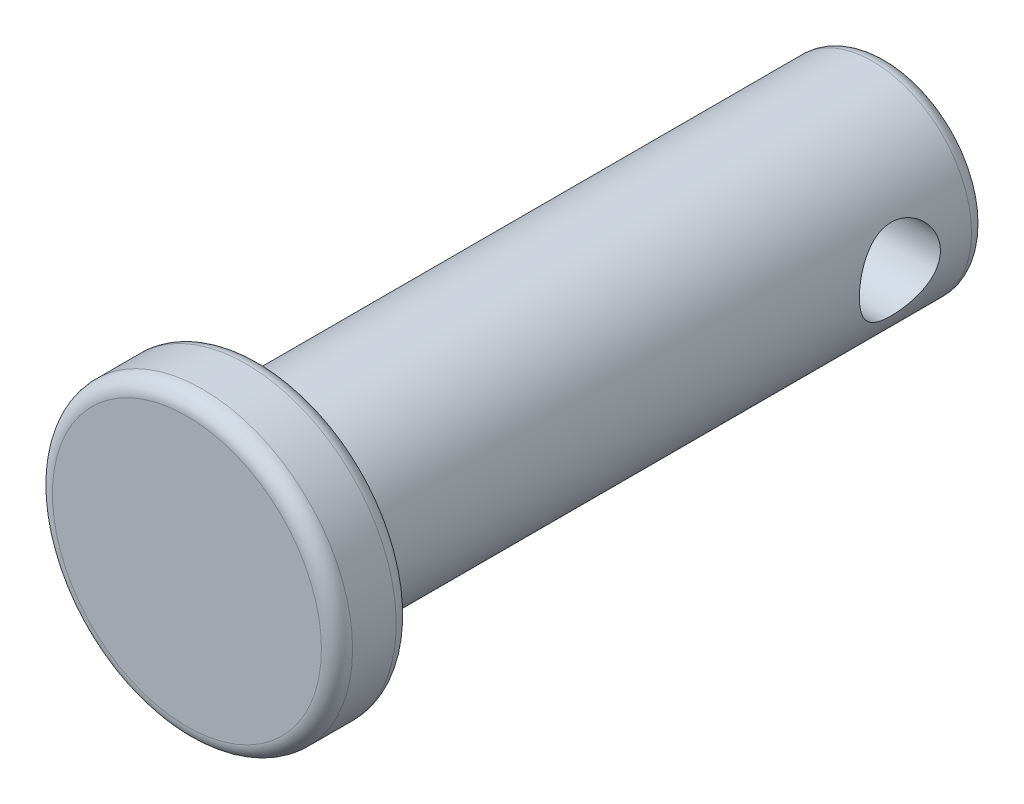
ISO-10303-21;
HEADER;
FILE_DESCRIPTION(('STEP AP214'),'2;1');
FILE_NAME('part.step','',(''),(''),'','','');
FILE_SCHEMA(('AUTOMOTIVE_DESIGN { 1 0 10303 214 1 1 1 1 }'));
ENDSEC;
DATA;
#1=APPLICATION_CONTEXT('core data for automotive mechanical design processes');
#2=APPLICATION_PROTOCOL_DEFINITION('international standard','automotive_design',2000,#1);
#3=PRODUCT_CONTEXT('',#1,'mechanical');
#4=PRODUCT('Part','Part','',(#3));
#5=PRODUCT_RELATED_PRODUCT_CATEGORY('part','',(#4));
#6=PRODUCT_DEFINITION_FORMATION('','',#4);
#7=PRODUCT_DEFINITION_CONTEXT('part definition',#1,'design');
#8=PRODUCT_DEFINITION('design','',#6,#7);
#9=PRODUCT_DEFINITION_SHAPE('','',#8);
#10=(LENGTH_UNIT() NAMED_UNIT(*) SI_UNIT(.MILLI.,.METRE.));
#11=(NAMED_UNIT(*) PLANE_ANGLE_UNIT() SI_UNIT($,.RADIAN.));
#12=(NAMED_UNIT(*) SI_UNIT($,.STERADIAN.) SOLID_ANGLE_UNIT());
#13=UNCERTAINTY_MEASURE_WITH_UNIT(LENGTH_MEASURE(1.E-05),#10,'distance_accuracy_value','');
#14=(GEOMETRIC_REPRESENTATION_CONTEXT(3) GLOBAL_UNCERTAINTY_ASSIGNED_CONTEXT((#13)) GLOBAL_UNIT_ASSIGNED_CONTEXT((#10,
#11,#12)) REPRESENTATION_CONTEXT('',''));
#15=CARTESIAN_POINT('',(0.,0.,0.));
#16=DIRECTION('',(0.,0.,1.));
#17=DIRECTION('',(1.,0.,0.));
#18=AXIS2_PLACEMENT_3D('',#15,#16,#17);
#19=CARTESIAN_POINT('',(0.,0.,0.));
#20=DIRECTION('',(0.,0.,1.));
#21=DIRECTION('',(1.,0.,0.));
#22=AXIS2_PLACEMENT_3D('',#19,#20,#21);
#23=PLANE('',#22);
#24=CARTESIAN_POINT('',(0.,0.,0.));
#25=DIRECTION('',(0.,0.,1.));
#26=DIRECTION('',(1.,0.,0.));
#27=AXIS2_PLACEMENT_3D('',#24,#25,#26);
#28=CIRCLE('',#27,4.31499999999996);
#29=CARTESIAN_POINT('',(4.31499999999996,0.,0.));
#30=VERTEX_POINT('',#29);
#31=EDGE_CURVE('E48',#30,#30,#28,.T.);
#32=ORIENTED_EDGE('',*,*,#31,.T.);
#33=EDGE_LOOP('',(#32));
#34=FACE_BOUND('',#33,.T.);
#35=ADVANCED_FACE('F37',(#34),#23,.T.);
#36=CARTESIAN_POINT('',(0.,0.,-335.576810525071));
#37=DIRECTION('',(0.,0.,-1.));
#38=DIRECTION('',(-1.,0.,0.));
#39=AXIS2_PLACEMENT_3D('',#36,#37,#38);
#40=CYLINDRICAL_SURFACE('',#39,4.81499999999996);
#41=CARTESIAN_POINT('',(0.,0.,-1.90000000000001));
#42=DIRECTION('',(0.,0.,-1.));
#43=DIRECTION('',(-1.,0.,0.));
#44=AXIS2_PLACEMENT_3D('',#41,#42,#43);
#45=CIRCLE('',#44,4.81499999999996);
#46=CARTESIAN_POINT('',(-4.81499999999996,0.,-1.90000000000001));
#47=VERTEX_POINT('',#46);
#48=EDGE_CURVE('E52',#47,#47,#45,.F.);
#49=ORIENTED_EDGE('',*,*,#48,.T.);
#50=EDGE_LOOP('',(#49));
#51=FACE_BOUND('',#50,.T.);
#52=CARTESIAN_POINT('',(0.,0.,-0.5));
#53=DIRECTION('',(0.,0.,1.));
#54=DIRECTION('',(1.,0.,0.));
#55=AXIS2_PLACEMENT_3D('',#52,#53,#54);
#56=CIRCLE('',#55,4.81499999999996);
#57=CARTESIAN_POINT('',(4.81499999999996,0.,-0.5));
#58=VERTEX_POINT('',#57);
#59=EDGE_CURVE('E57',#58,#58,#56,.F.);
#60=ORIENTED_EDGE('',*,*,#59,.T.);
#61=EDGE_LOOP('',(#60));
#62=FACE_BOUND('',#61,.T.);
#63=ADVANCED_FACE('F98',(#51,#62),#40,.T.);
#64=CARTESIAN_POINT('',(0.,4.81499999999996,-2.4));
#65=DIRECTION('',(0.,0.,-1.));
#66=DIRECTION('',(-1.,0.,0.));
#67=AXIS2_PLACEMENT_3D('',#64,#65,#66);
#68=PLANE('',#67);
#69=CARTESIAN_POINT('',(0.,0.,-2.4));
#70=DIRECTION('',(0.,0.,-1.));
#71=DIRECTION('',(-1.,0.,0.));
#72=AXIS2_PLACEMENT_3D('',#69,#70,#71);
#73=CIRCLE('',#72,4.31499999999996);
#74=CARTESIAN_POINT('',(-4.31499999999996,0.,-2.4));
#75=VERTEX_POINT('',#74);
#76=EDGE_CURVE('E60',#75,#75,#73,.T.);
#77=ORIENTED_EDGE('',*,*,#76,.T.);
#78=EDGE_LOOP('',(#77));
#79=FACE_BOUND('',#78,.T.);
#80=CARTESIAN_POINT('',(0.,0.,-2.40000000000001));
#81=DIRECTION('',(0.,0.,-1.));
#82=DIRECTION('',(-1.,0.,0.));
#83=AXIS2_PLACEMENT_3D('',#80,#81,#82);
#84=CIRCLE('',#83,3.17499999999996);
#85=CARTESIAN_POINT('',(-3.17499999999996,0.,-2.40000000000001));
#86=VERTEX_POINT('',#85);
#87=EDGE_CURVE('E63',#86,#86,#84,.T.);
#88=ORIENTED_EDGE('',*,*,#87,.F.);
#89=EDGE_LOOP('',(#88));
#90=FACE_BOUND('',#89,.T.);
#91=ADVANCED_FACE('F104',(#79,#90),#68,.T.);
#92=CARTESIAN_POINT('',(0.,0.,-335.576810525071));
#93=DIRECTION('',(0.,0.,-1.));
#94=DIRECTION('',(-1.,0.,0.));
#95=AXIS2_PLACEMENT_3D('',#92,#93,#94);
#96=CYLINDRICAL_SURFACE('',#95,3.17499999999996);
#97=CARTESIAN_POINT('',(0.,0.,-22.));
#98=DIRECTION('',(0.,0.,1.));
#99=DIRECTION('',(1.,0.,0.));
#100=AXIS2_PLACEMENT_3D('',#97,#98,#99);
#101=CIRCLE('',#100,3.17499999999996);
#102=CARTESIAN_POINT('',(3.17499999999996,0.,-22.));
#103=VERTEX_POINT('',#102);
#104=EDGE_CURVE('E10',#103,#103,#101,.T.);
#105=ORIENTED_EDGE('',*,*,#104,.T.);
#106=EDGE_LOOP('',(#105));
#107=FACE_BOUND('',#106,.T.);
#108=CARTESIAN_POINT('',(-3.17499999999996,0.,-18.4));
#109=CARTESIAN_POINT('',(-3.17499471773082,0.0697385475572229,-18.4000070749055));
#110=CARTESIAN_POINT('',(-3.17267552002936,0.13959187545915,-18.4056450814286));
#111=CARTESIAN_POINT('',(-3.16362322232198,0.277323448606077,-18.4279991908106));
#112=CARTESIAN_POINT('',(-3.15687839039144,0.345195941955909,-18.4447447399727));
#113=CARTESIAN_POINT('',(-3.1397005130023,0.47674941596077,-18.4885964065181));
#114=CARTESIAN_POINT('',(-3.12927979006259,0.5404435676328,-18.5156679329657));
#115=CARTESIAN_POINT('',(-3.10576988962442,0.662326355552351,-18.5792627601992));
#116=CARTESIAN_POINT('',(-3.0926815720534,0.720516757164088,-18.6157830161066));
#117=CARTESIAN_POINT('',(-3.06443707139534,0.832672374310063,-18.6991239927602));
#118=CARTESIAN_POINT('',(-3.04921469584617,0.886333392155718,-18.746331472875));
#119=CARTESIAN_POINT('',(-3.01871133808473,0.985236444135586,-18.848889773038));
#120=CARTESIAN_POINT('',(-3.00343033001475,1.0304741848533,-18.9042447203234));
#121=CARTESIAN_POINT('',(-2.97373634122923,1.11335020809138,-19.0246917046801));
#122=CARTESIAN_POINT('',(-2.9593982127194,1.15052984781277,-19.0901196930443));
#123=CARTESIAN_POINT('',(-2.9342581638112,1.21322024662256,-19.2269742640324));
#124=CARTESIAN_POINT('',(-2.92345448450506,1.23873681232245,-19.2983978406643));
#125=CARTESIAN_POINT('',(-2.90732044867926,1.27613180906288,-19.4417168289158));
#126=CARTESIAN_POINT('',(-2.90175688693594,1.28859442354419,-19.5134325725601));
#127=CARTESIAN_POINT('',(-2.89605999939638,1.30135139579376,-19.6581365641312));
#128=CARTESIAN_POINT('',(-2.89592382386313,1.30165213935049,-19.731124124128));
#129=CARTESIAN_POINT('',(-2.90089903773204,1.29051801449662,-19.8705724632797));
#130=CARTESIAN_POINT('',(-2.90562524591533,1.27994458280539,-19.9371184861099));
#131=CARTESIAN_POINT('',(-2.91914371857914,1.24880343181336,-20.067392456085));
#132=CARTESIAN_POINT('',(-2.9279367308279,1.22823387447742,-20.1311198826092));
#133=CARTESIAN_POINT('',(-2.94879443802772,1.17728704391301,-20.2555265299978));
#134=CARTESIAN_POINT('',(-2.96092371670994,1.14671363132816,-20.3161141152285));
#135=CARTESIAN_POINT('',(-2.98707106831779,1.07676518245026,-20.4315290005667));
#136=CARTESIAN_POINT('',(-3.00108987032831,1.03738674479681,-20.486354062561));
#137=CARTESIAN_POINT('',(-3.03082467800878,0.947183727212342,-20.5933809532518));
#138=CARTESIAN_POINT('',(-3.04658598223318,0.895688646127665,-20.6450066579015));
#139=CARTESIAN_POINT('',(-3.07706454483951,0.784610202686223,-20.739078970038));
#140=CARTESIAN_POINT('',(-3.09178157457979,0.72502507730084,-20.7815235714834));
#141=CARTESIAN_POINT('',(-3.11891449676848,0.597758338988071,-20.8568343917903));
#142=CARTESIAN_POINT('',(-3.13127383684915,0.52992967689708,-20.889473986813));
#143=CARTESIAN_POINT('',(-3.15186767592607,0.389109356435436,-20.9426788174009));
#144=CARTESIAN_POINT('',(-3.16010437358675,0.316120473839972,-20.9632504899719));
#145=CARTESIAN_POINT('',(-3.17111853119767,0.171872631359506,-20.9905475126901));
#146=CARTESIAN_POINT('',(-3.17420053958432,0.100783275895725,-20.998046499005));
#147=CARTESIAN_POINT('',(-3.17552457259704,-0.0416985700941602,-21.0012820680311));
#148=CARTESIAN_POINT('',(-3.1737679268245,-0.113090971964114,-20.9970218820146));
#149=CARTESIAN_POINT('',(-3.16581041241441,-0.250580537643221,-20.977420594452));
#150=CARTESIAN_POINT('',(-3.15982487281914,-0.316768060451652,-20.962616108577));
#151=CARTESIAN_POINT('',(-3.14423849387075,-0.445652473104766,-20.9230859915411));
#152=CARTESIAN_POINT('',(-3.13463719415185,-0.508348917291078,-20.898359097013));
#153=CARTESIAN_POINT('',(-3.11237609476766,-0.63065447422845,-20.8388776563861));
#154=CARTESIAN_POINT('',(-3.09963097540185,-0.690108383222621,-20.8038369361275));
#155=CARTESIAN_POINT('',(-3.07245209219684,-0.802503626373623,-20.7250382110095));
#156=CARTESIAN_POINT('',(-3.05801763577462,-0.85544227107027,-20.6812766256252));
#157=CARTESIAN_POINT('',(-3.02778850887052,-0.957146013374954,-20.5827367653605));
#158=CARTESIAN_POINT('',(-3.01196876982359,-1.00536993895043,-20.5274061870496));
#159=CARTESIAN_POINT('',(-2.98165915773807,-1.0919913246789,-20.4091730429418));
#160=CARTESIAN_POINT('',(-2.96716954949222,-1.13038683097106,-20.3462689752063));
#161=CARTESIAN_POINT('',(-2.94109937825214,-1.19659804466205,-20.2135336391075));
#162=CARTESIAN_POINT('',(-2.92955640381139,-1.22427916999055,-20.1436273181408));
#163=CARTESIAN_POINT('',(-2.91122935856755,-1.26725081402779,-19.9995270089333));
#164=CARTESIAN_POINT('',(-2.90444154570174,-1.28255107729957,-19.9253364420534));
#165=CARTESIAN_POINT('',(-2.89695152633085,-1.29937439690994,-19.7807558022472));
#166=CARTESIAN_POINT('',(-2.89583195394687,-1.30184270134042,-19.7104967540301));
#167=CARTESIAN_POINT('',(-2.89870299940542,-1.29543754428633,-19.5706111678345));
#168=CARTESIAN_POINT('',(-2.90269289507955,-1.28656568561228,-19.5009845418707));
#169=CARTESIAN_POINT('',(-2.91495757112195,-1.25851666391419,-19.3674474452372));
#170=CARTESIAN_POINT('',(-2.92303879873162,-1.23980363768124,-19.3034200445734));
#171=CARTESIAN_POINT('',(-2.94243049750309,-1.19304858436067,-19.179394005196));
#172=CARTESIAN_POINT('',(-2.95374186935035,-1.16500395491097,-19.1193964959391));
#173=CARTESIAN_POINT('',(-2.97914634436299,-1.0984759176819,-19.0012779029628));
#174=CARTESIAN_POINT('',(-2.99336408350757,-1.05947479347976,-18.9434756916615));
#175=CARTESIAN_POINT('',(-3.022617588271,-0.972879635150546,-18.834940058781));
#176=CARTESIAN_POINT('',(-3.03765362047117,-0.925282788882288,-18.7842089602105));
#177=CARTESIAN_POINT('',(-3.06810151774256,-0.818926854956606,-18.6876428156514));
#178=CARTESIAN_POINT('',(-3.08346722320563,-0.759622822231814,-18.6423906628195));
#179=CARTESIAN_POINT('',(-3.11178803576171,-0.63368700374861,-18.5624583797858));
#180=CARTESIAN_POINT('',(-3.12474203551699,-0.567051874137646,-18.5277831013275));
#181=CARTESIAN_POINT('',(-3.14657765019543,-0.429467489655966,-18.4707692563305));
#182=CARTESIAN_POINT('',(-3.15552665469237,-0.358614304331467,-18.4482251400117));
#183=CARTESIAN_POINT('',(-3.16861988762302,-0.213811006099505,-18.4155711148338));
#184=CARTESIAN_POINT('',(-3.1727792480366,-0.139871415553857,-18.4054220399811));
#185=CARTESIAN_POINT('',(-3.17477489036379,-0.0438119362170576,-18.4005514379168));
#186=CARTESIAN_POINT('',(-3.17500165967242,-0.0219116336477319,-18.3999977770868));
#187=CARTESIAN_POINT('',(-3.17499999999996,0.,-18.4));
#188=B_SPLINE_CURVE_WITH_KNOTS('',3,(#108,#109,#110,#111,#112,#113,#114,#115,#116,#117,#118,
#119,#120,#121,#122,#123,#124,#125,#126,#127,#128,#129,#130,#131,#132,#133,#134,#135,#136,#137,
#138,#139,#140,#141,#142,#143,#144,#145,#146,#147,#148,#149,#150,#151,#152,#153,#154,#155,#156,
#157,#158,#159,#160,#161,#162,#163,#164,#165,#166,#167,#168,#169,#170,#171,#172,#173,#174,#175,
#176,#177,#178,#179,#180,#181,#182,#183,#184,#185,#186,#187),.UNSPECIFIED.,.T.,.F.,(4,2,2,2,2,2,
2,2,2,2,2,2,2,2,2,2,2,2,2,2,2,2,2,2,2,2,2,2,2,2,2,2,2,2,2,2,2,2,2,4),(0.,0.209154917620333,
0.418866536780184,0.627881727655604,0.83682964653319,1.05509673957396,1.27347478248531,
1.50214491988488,1.73070108657607,1.94852411683016,2.16623277406745,2.36793064735773,
2.56966562183534,2.77562008326446,2.98165424228861,3.20444752177602,3.42728943181047,
3.65494331764365,3.88247566267766,4.09601688880986,4.30949944234941,4.51282930491076,
4.71618506459283,4.92582282366193,5.13554683167725,5.35976291391745,5.58402353509912,
5.81101611910924,6.03782987058783,6.24767166312357,6.45748380005038,6.6581867579465,
6.85894573409773,7.07153405940589,7.28419206064852,7.51158656814839,7.73908522800749,
7.9625970030966,8.18540068047748,8.25111650179937),.UNSPECIFIED.);
#189=CARTESIAN_POINT('',(-3.17499999999996,0.,-18.4));
#190=VERTEX_POINT('',#189);
#191=EDGE_CURVE('E64',#190,#190,#188,.T.);
#192=ORIENTED_EDGE('',*,*,#191,.F.);
#193=EDGE_LOOP('',(#192));
#194=FACE_BOUND('',#193,.T.);
#195=CARTESIAN_POINT('',(3.17499999999996,0.,-21.));
#196=CARTESIAN_POINT('',(3.17499471773082,0.0697385475572216,-20.9999929250945));
#197=CARTESIAN_POINT('',(3.17267552002936,0.139591875459147,-20.9943549185713));
#198=CARTESIAN_POINT('',(3.16362322232198,0.277323448606074,-20.9720008091893));
#199=CARTESIAN_POINT('',(3.15687839039144,0.345195941955908,-20.9552552600273));
#200=CARTESIAN_POINT('',(3.1397005130023,0.476749415960771,-20.9114035934818));
#201=CARTESIAN_POINT('',(3.12927979006259,0.540443567632802,-20.8843320670342));
#202=CARTESIAN_POINT('',(3.10576988962442,0.662326355552352,-20.8207372398007));
#203=CARTESIAN_POINT('',(3.0926815720534,0.720516757164089,-20.7842169838934));
#204=CARTESIAN_POINT('',(3.06443707139534,0.832672374310063,-20.7008760072397));
#205=CARTESIAN_POINT('',(3.04921469584617,0.886333392155718,-20.6536685271249));
#206=CARTESIAN_POINT('',(3.01871133808473,0.985236444135587,-20.551110226962));
#207=CARTESIAN_POINT('',(3.00343033001475,1.0304741848533,-20.4957552796765));
#208=CARTESIAN_POINT('',(2.97373634122923,1.11335020809138,-20.3753082953199));
#209=CARTESIAN_POINT('',(2.9593982127194,1.15052984781277,-20.3098803069556));
#210=CARTESIAN_POINT('',(2.9342581638112,1.21322024662256,-20.1730257359676));
#211=CARTESIAN_POINT('',(2.92345448450506,1.23873681232245,-20.1016021593357));
#212=CARTESIAN_POINT('',(2.90732044867926,1.27613180906288,-19.9582831710842));
#213=CARTESIAN_POINT('',(2.90175688693594,1.28859442354419,-19.8865674274398));
#214=CARTESIAN_POINT('',(2.89605999939638,1.30135139579376,-19.7418634358688));
#215=CARTESIAN_POINT('',(2.89592382386313,1.30165213935049,-19.668875875872));
#216=CARTESIAN_POINT('',(2.90089903773204,1.29051801449662,-19.5294275367202));
#217=CARTESIAN_POINT('',(2.90562524591533,1.27994458280539,-19.46288151389));
#218=CARTESIAN_POINT('',(2.91914371857914,1.24880343181336,-19.3326075439149));
#219=CARTESIAN_POINT('',(2.9279367308279,1.22823387447742,-19.2688801173907));
#220=CARTESIAN_POINT('',(2.94879443802772,1.17728704391301,-19.1444734700022));
#221=CARTESIAN_POINT('',(2.96092371670994,1.14671363132816,-19.0838858847715));
#222=CARTESIAN_POINT('',(2.98707106831779,1.07676518245026,-18.9684709994332));
#223=CARTESIAN_POINT('',(3.00108987032831,1.03738674479681,-18.913645937439));
#224=CARTESIAN_POINT('',(3.03082467800878,0.947183727212342,-18.8066190467481));
#225=CARTESIAN_POINT('',(3.04658598223318,0.895688646127665,-18.7549933420984));
#226=CARTESIAN_POINT('',(3.07706454483951,0.784610202686223,-18.660921029962));
#227=CARTESIAN_POINT('',(3.09178157457979,0.72502507730084,-18.6184764285166));
#228=CARTESIAN_POINT('',(3.11891449676848,0.59775833898807,-18.5431656082097));
#229=CARTESIAN_POINT('',(3.13127383684915,0.529929676897079,-18.510526013187));
#230=CARTESIAN_POINT('',(3.15186767592607,0.389109356435435,-18.457321182599));
#231=CARTESIAN_POINT('',(3.16010437358675,0.316120473839971,-18.4367495100281));
#232=CARTESIAN_POINT('',(3.17111853119767,0.171872631359505,-18.4094524873099));
#233=CARTESIAN_POINT('',(3.17420053958432,0.100783275895725,-18.401953500995));
#234=CARTESIAN_POINT('',(3.17552457259704,-0.0416985700941607,-18.3987179319688));
#235=CARTESIAN_POINT('',(3.1737679268245,-0.113090971964114,-18.4029781179854));
#236=CARTESIAN_POINT('',(3.16581041241441,-0.250580537643222,-18.422579405548));
#237=CARTESIAN_POINT('',(3.15982487281914,-0.316768060451652,-18.437383891423));
#238=CARTESIAN_POINT('',(3.14423849387075,-0.445652473104766,-18.4769140084589));
#239=CARTESIAN_POINT('',(3.13463719415185,-0.508348917291079,-18.501640902987));
#240=CARTESIAN_POINT('',(3.11237609476766,-0.630654474228451,-18.5611223436138));
#241=CARTESIAN_POINT('',(3.09963097540185,-0.690108383222623,-18.5961630638725));
#242=CARTESIAN_POINT('',(3.07245209219684,-0.802503626373625,-18.6749617889905));
#243=CARTESIAN_POINT('',(3.05801763577462,-0.855442271070271,-18.7187233743748));
#244=CARTESIAN_POINT('',(3.02778850887052,-0.957146013374955,-18.8172632346395));
#245=CARTESIAN_POINT('',(3.01196876982359,-1.00536993895043,-18.8725938129504));
#246=CARTESIAN_POINT('',(2.98165915773807,-1.0919913246789,-18.9908269570582));
#247=CARTESIAN_POINT('',(2.96716954949222,-1.13038683097106,-19.0537310247936));
#248=CARTESIAN_POINT('',(2.94109937825214,-1.19659804466205,-19.1864663608924));
#249=CARTESIAN_POINT('',(2.92955640381139,-1.22427916999055,-19.2563726818592));
#250=CARTESIAN_POINT('',(2.91122935856755,-1.26725081402779,-19.4004729910666));
#251=CARTESIAN_POINT('',(2.90444154570174,-1.28255107729957,-19.4746635579466));
#252=CARTESIAN_POINT('',(2.89695152633085,-1.29937439690994,-19.6192441977527));
#253=CARTESIAN_POINT('',(2.89583195394687,-1.30184270134042,-19.6895032459699));
#254=CARTESIAN_POINT('',(2.89870299940542,-1.29543754428633,-19.8293888321655));
#255=CARTESIAN_POINT('',(2.90269289507955,-1.28656568561228,-19.8990154581293));
#256=CARTESIAN_POINT('',(2.91495757112195,-1.25851666391419,-20.0325525547627));
#257=CARTESIAN_POINT('',(2.92303879873162,-1.23980363768124,-20.0965799554266));
#258=CARTESIAN_POINT('',(2.94243049750309,-1.19304858436067,-20.220605994804));
#259=CARTESIAN_POINT('',(2.95374186935035,-1.16500395491097,-20.2806035040608));
#260=CARTESIAN_POINT('',(2.97914634436299,-1.0984759176819,-20.3987220970371));
#261=CARTESIAN_POINT('',(2.99336408350757,-1.05947479347976,-20.4565243083385));
#262=CARTESIAN_POINT('',(3.022617588271,-0.972879635150547,-20.565059941219));
#263=CARTESIAN_POINT('',(3.03765362047117,-0.925282788882288,-20.6157910397895));
#264=CARTESIAN_POINT('',(3.06810151774256,-0.818926854956605,-20.7123571843486));
#265=CARTESIAN_POINT('',(3.08346722320563,-0.759622822231813,-20.7576093371804));
#266=CARTESIAN_POINT('',(3.11178803576171,-0.633687003748608,-20.8375416202142));
#267=CARTESIAN_POINT('',(3.12474203551699,-0.567051874137643,-20.8722168986725));
#268=CARTESIAN_POINT('',(3.14657765019543,-0.429467489655964,-20.9292307436695));
#269=CARTESIAN_POINT('',(3.15552665469237,-0.358614304331466,-20.9517748599883));
#270=CARTESIAN_POINT('',(3.16861988762302,-0.213811006099505,-20.9844288851662));
#271=CARTESIAN_POINT('',(3.1727792480366,-0.139871415553857,-20.9945779600188));
#272=CARTESIAN_POINT('',(3.17477489036379,-0.043811936217057,-20.9994485620831));
#273=CARTESIAN_POINT('',(3.17500165967242,-0.0219116336477316,-21.0000022229132));
#274=CARTESIAN_POINT('',(3.17499999999996,0.,-21.));
#275=B_SPLINE_CURVE_WITH_KNOTS('',3,(#195,#196,#197,#198,#199,#200,#201,#202,#203,#204,#205,
#206,#207,#208,#209,#210,#211,#212,#213,#214,#215,#216,#217,#218,#219,#220,#221,#222,#223,#224,
#225,#226,#227,#228,#229,#230,#231,#232,#233,#234,#235,#236,#237,#238,#239,#240,#241,#242,#243,
#244,#245,#246,#247,#248,#249,#250,#251,#252,#253,#254,#255,#256,#257,#258,#259,#260,#261,#262,
#263,#264,#265,#266,#267,#268,#269,#270,#271,#272,#273,#274),.UNSPECIFIED.,.T.,.F.,(4,2,2,2,2,2,
2,2,2,2,2,2,2,2,2,2,2,2,2,2,2,2,2,2,2,2,2,2,2,2,2,2,2,2,2,2,2,2,2,4),(0.,0.209154917620331,
0.418866536780185,0.627881727655607,0.836829646533192,1.05509673957397,1.27347478248532,
1.50214491988488,1.73070108657607,1.94852411683016,2.16623277406746,2.36793064735772,
2.56966562183534,2.77562008326446,2.98165424228861,3.20444752177602,3.42728943181047,
3.65494331764365,3.88247566267766,4.09601688880986,4.30949944234941,4.51282930491076,
4.71618506459283,4.92582282366193,5.13554683167725,5.35976291391745,5.58402353509913,
5.81101611910924,6.03782987058784,6.24767166312357,6.45748380005038,6.6581867579465,
6.85894573409773,7.07153405940589,7.28419206064852,7.51158656814839,7.73908522800749,
7.9625970030966,8.18540068047748,8.25111650179937),.UNSPECIFIED.);
#276=CARTESIAN_POINT('',(3.17499999999996,0.,-21.));
#277=VERTEX_POINT('',#276);
#278=EDGE_CURVE('E72',#277,#277,#275,.T.);
#279=ORIENTED_EDGE('',*,*,#278,.F.);
#280=EDGE_LOOP('',(#279));
#281=FACE_BOUND('',#280,.T.);
#282=ORIENTED_EDGE('',*,*,#87,.T.);
#283=EDGE_LOOP('',(#282));
#284=FACE_BOUND('',#283,.T.);
#285=ADVANCED_FACE('F77',(#107,#194,#281,#284),#96,.T.);
#286=CARTESIAN_POINT('',(-4.81499999999996,0.,-19.7));
#287=DIRECTION('',(1.,0.,0.));
#288=DIRECTION('',(0.,0.,-1.));
#289=AXIS2_PLACEMENT_3D('',#286,#287,#288);
#290=CYLINDRICAL_SURFACE('',#289,1.3);
#291=ORIENTED_EDGE('',*,*,#191,.T.);
#292=EDGE_LOOP('',(#291));
#293=FACE_BOUND('',#292,.T.);
#294=ORIENTED_EDGE('',*,*,#278,.T.);
#295=EDGE_LOOP('',(#294));
#296=FACE_BOUND('',#295,.T.);
#297=ADVANCED_FACE('F80',(#293,#296),#290,.F.);
#298=CARTESIAN_POINT('',(0.,0.,-1.90000000000001));
#299=DIRECTION('',(0.,0.,-1.));
#300=DIRECTION('',(-1.,0.,0.));
#301=AXIS2_PLACEMENT_3D('',#298,#299,#300);
#302=TOROIDAL_SURFACE('',#301,4.31499999999996,0.5);
#303=ORIENTED_EDGE('',*,*,#48,.F.);
#304=EDGE_LOOP('',(#303));
#305=FACE_BOUND('',#304,.T.);
#306=ORIENTED_EDGE('',*,*,#76,.F.);
#307=EDGE_LOOP('',(#306));
#308=FACE_BOUND('',#307,.T.);
#309=ADVANCED_FACE('F84',(#305,#308),#302,.T.);
#310=CARTESIAN_POINT('',(0.,0.,-0.5));
#311=DIRECTION('',(0.,0.,1.));
#312=DIRECTION('',(1.,0.,0.));
#313=AXIS2_PLACEMENT_3D('',#310,#311,#312);
#314=TOROIDAL_SURFACE('',#313,4.31499999999996,0.5);
#315=ORIENTED_EDGE('',*,*,#31,.F.);
#316=EDGE_LOOP('',(#315));
#317=FACE_BOUND('',#316,.T.);
#318=ORIENTED_EDGE('',*,*,#59,.F.);
#319=EDGE_LOOP('',(#318));
#320=FACE_BOUND('',#319,.T.);
#321=ADVANCED_FACE('F89',(#317,#320),#314,.T.);
#322=CARTESIAN_POINT('',(-4.81499999999996,-3.17499999999996,-22.5));
#323=DIRECTION('',(0.,0.,1.));
#324=DIRECTION('',(1.,0.,0.));
#325=AXIS2_PLACEMENT_3D('',#322,#323,#324);
#326=PLANE('',#325);
#327=CARTESIAN_POINT('',(0.,0.,-22.5));
#328=DIRECTION('',(0.,0.,1.));
#329=DIRECTION('',(1.,0.,0.));
#330=AXIS2_PLACEMENT_3D('',#327,#328,#329);
#331=CIRCLE('',#330,2.67499999999996);
#332=CARTESIAN_POINT('',(2.67499999999996,0.,-22.5));
#333=VERTEX_POINT('',#332);
#334=EDGE_CURVE('E44',#333,#333,#331,.F.);
#335=ORIENTED_EDGE('',*,*,#334,.T.);
#336=EDGE_LOOP('',(#335));
#337=FACE_BOUND('',#336,.T.);
#338=ADVANCED_FACE('F86',(#337),#326,.F.);
#339=CARTESIAN_POINT('',(0.,0.,-22.));
#340=DIRECTION('',(0.,0.,1.));
#341=DIRECTION('',(1.,0.,0.));
#342=AXIS2_PLACEMENT_3D('',#339,#340,#341);
#343=TOROIDAL_SURFACE('',#342,2.67499999999996,0.5);
#344=ORIENTED_EDGE('',*,*,#104,.F.);
#345=EDGE_LOOP('',(#344));
#346=FACE_BOUND('',#345,.T.);
#347=ORIENTED_EDGE('',*,*,#334,.F.);
#348=EDGE_LOOP('',(#347));
#349=FACE_BOUND('',#348,.T.);
#350=ADVANCED_FACE('F39',(#346,#349),#343,.T.);
#351=CLOSED_SHELL('',(#35,#63,#91,#285,#297,#309,#321,#338,#350));
#352=MANIFOLD_SOLID_BREP('B2',#351);
#353=ADVANCED_BREP_SHAPE_REPRESENTATION('',(#18,#352),#14);
#354=SHAPE_DEFINITION_REPRESENTATION(#9,#353);
ENDSEC;
END-ISO-10303-21;
